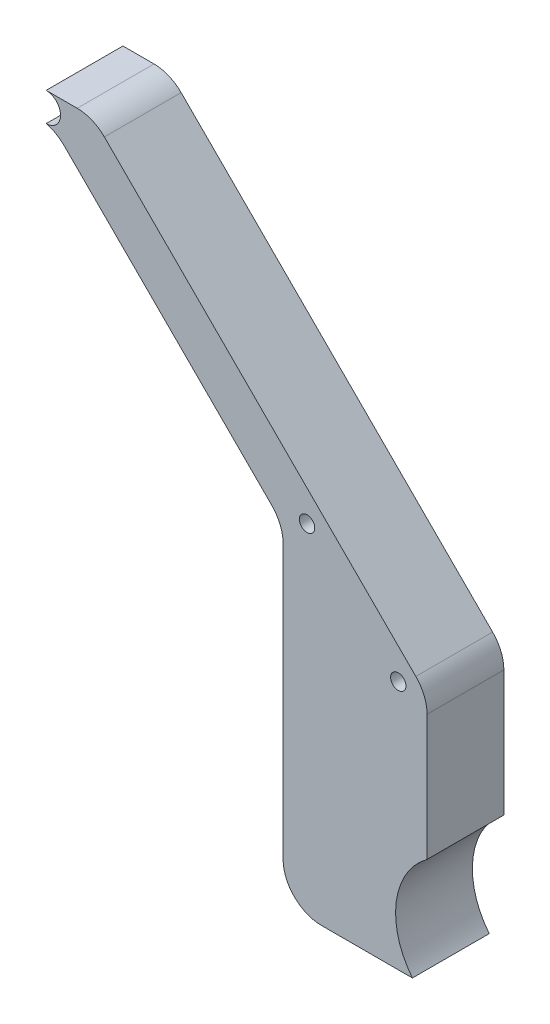
ISO-10303-21;
HEADER;
FILE_DESCRIPTION(('STEP AP214'),'2;1');
FILE_NAME('part.step','',(''),(''),'','','');
FILE_SCHEMA(('AUTOMOTIVE_DESIGN { 1 0 10303 214 1 1 1 1 }'));
ENDSEC;
DATA;
#1=APPLICATION_CONTEXT('core data for automotive mechanical design processes');
#2=APPLICATION_PROTOCOL_DEFINITION('international standard','automotive_design',2000,#1);
#3=PRODUCT_CONTEXT('',#1,'mechanical');
#4=PRODUCT('Part','Part','',(#3));
#5=PRODUCT_RELATED_PRODUCT_CATEGORY('part','',(#4));
#6=PRODUCT_DEFINITION_FORMATION('','',#4);
#7=PRODUCT_DEFINITION_CONTEXT('part definition',#1,'design');
#8=PRODUCT_DEFINITION('design','',#6,#7);
#9=PRODUCT_DEFINITION_SHAPE('','',#8);
#10=(LENGTH_UNIT() NAMED_UNIT(*) SI_UNIT(.MILLI.,.METRE.));
#11=(NAMED_UNIT(*) PLANE_ANGLE_UNIT() SI_UNIT($,.RADIAN.));
#12=(NAMED_UNIT(*) SI_UNIT($,.STERADIAN.) SOLID_ANGLE_UNIT());
#13=UNCERTAINTY_MEASURE_WITH_UNIT(LENGTH_MEASURE(1.E-05),#10,'distance_accuracy_value','');
#14=(GEOMETRIC_REPRESENTATION_CONTEXT(3) GLOBAL_UNCERTAINTY_ASSIGNED_CONTEXT((#13)) GLOBAL_UNIT_ASSIGNED_CONTEXT((#10,
#11,#12)) REPRESENTATION_CONTEXT('',''));
#15=CARTESIAN_POINT('',(0.,0.,0.));
#16=DIRECTION('',(0.,0.,1.));
#17=DIRECTION('',(1.,0.,0.));
#18=AXIS2_PLACEMENT_3D('',#15,#16,#17);
#19=CARTESIAN_POINT('',(0.0303342495161785,8.21230643760333,-8.));
#20=DIRECTION('',(1.,0.,0.));
#21=DIRECTION('',(0.,0.,-1.));
#22=AXIS2_PLACEMENT_3D('',#19,#20,#21);
#23=PLANE('',#22);
#24=DIRECTION('',(0.,0.,1.));
#25=VECTOR('',#24,1.);
#26=CARTESIAN_POINT('',(0.0303342495161819,-6.54052980472011,-8.));
#27=LINE('',#26,#25);
#28=CARTESIAN_POINT('',(0.0303342495161819,-6.54052980472011,-8.));
#29=VERTEX_POINT('',#28);
#30=CARTESIAN_POINT('',(0.0303342495161819,-6.54052980472011,0.));
#31=VERTEX_POINT('',#30);
#32=EDGE_CURVE('E139',#29,#31,#27,.T.);
#33=ORIENTED_EDGE('',*,*,#32,.F.);
#34=DIRECTION('',(0.,1.,0.));
#35=VECTOR('',#34,1.);
#36=CARTESIAN_POINT('',(0.0303342495161785,8.21230643760333,-8.));
#37=LINE('',#36,#35);
#38=CARTESIAN_POINT('',(0.0303342495161785,6.55545218811096,-8.));
#39=VERTEX_POINT('',#38);
#40=EDGE_CURVE('E148',#29,#39,#37,.T.);
#41=ORIENTED_EDGE('',*,*,#40,.T.);
#42=DIRECTION('',(0.,0.,1.));
#43=VECTOR('',#42,1.);
#44=CARTESIAN_POINT('',(0.0303342495161785,6.55545218811096,-8.));
#45=LINE('',#44,#43);
#46=CARTESIAN_POINT('',(0.0303342495161785,6.55545218811096,0.));
#47=VERTEX_POINT('',#46);
#48=EDGE_CURVE('E238',#39,#47,#45,.T.);
#49=ORIENTED_EDGE('',*,*,#48,.T.);
#50=DIRECTION('',(0.,1.,0.));
#51=VECTOR('',#50,1.);
#52=CARTESIAN_POINT('',(0.0303342495161785,8.21230643760333,0.));
#53=LINE('',#52,#51);
#54=EDGE_CURVE('E150',#31,#47,#53,.T.);
#55=ORIENTED_EDGE('',*,*,#54,.F.);
#56=EDGE_LOOP('',(#33,#41,#49,#55));
#57=FACE_BOUND('',#56,.T.);
#58=ADVANCED_FACE('F41',(#57),#23,.T.);
#59=CARTESIAN_POINT('',(-14.9696657504838,4.99999999999992,-8.));
#60=DIRECTION('',(-1.,0.,0.));
#61=DIRECTION('',(0.,-1.,0.));
#62=AXIS2_PLACEMENT_3D('',#59,#60,#61);
#63=PLANE('',#62);
#64=DIRECTION('',(0.,-1.,0.));
#65=VECTOR('',#64,1.);
#66=CARTESIAN_POINT('',(-14.9696657504838,4.99999999999992,-8.));
#67=LINE('',#66,#65);
#68=CARTESIAN_POINT('',(-14.9696657504838,14.4843843762454,-8.));
#69=VERTEX_POINT('',#68);
#70=CARTESIAN_POINT('',(-14.9696657504838,-14.0000000000001,-8.));
#71=VERTEX_POINT('',#70);
#72=EDGE_CURVE('E184',#69,#71,#67,.T.);
#73=ORIENTED_EDGE('',*,*,#72,.T.);
#74=DIRECTION('',(0.,0.,1.));
#75=VECTOR('',#74,1.);
#76=CARTESIAN_POINT('',(-14.9696657504838,-14.0000000000001,-8.));
#77=LINE('',#76,#75);
#78=CARTESIAN_POINT('',(-14.9696657504838,-14.0000000000001,0.));
#79=VERTEX_POINT('',#78);
#80=EDGE_CURVE('E215',#71,#79,#77,.T.);
#81=ORIENTED_EDGE('',*,*,#80,.T.);
#82=DIRECTION('',(0.,-1.,0.));
#83=VECTOR('',#82,1.);
#84=CARTESIAN_POINT('',(-14.9696657504838,4.99999999999992,0.));
#85=LINE('',#84,#83);
#86=CARTESIAN_POINT('',(-14.9696657504838,14.4843843762454,0.));
#87=VERTEX_POINT('',#86);
#88=EDGE_CURVE('E161',#87,#79,#85,.T.);
#89=ORIENTED_EDGE('',*,*,#88,.F.);
#90=DIRECTION('',(0.,0.,1.));
#91=VECTOR('',#90,1.);
#92=CARTESIAN_POINT('',(-14.9696657504838,14.4843843762454,-8.));
#93=LINE('',#92,#91);
#94=EDGE_CURVE('E209',#87,#69,#93,.F.);
#95=ORIENTED_EDGE('',*,*,#94,.T.);
#96=EDGE_LOOP('',(#73,#81,#89,#95));
#97=FACE_BOUND('',#96,.T.);
#98=ADVANCED_FACE('F284',(#97),#63,.T.);
#99=CARTESIAN_POINT('',(-14.9696657504838,16.1412386257378,-8.));
#100=DIRECTION('',(-0.707106781186546,-0.707106781186549,0.));
#101=DIRECTION('',(0.707106781186549,-0.707106781186546,0.));
#102=AXIS2_PLACEMENT_3D('',#99,#100,#101);
#103=PLANE('',#102);
#104=DIRECTION('',(0.707106781186549,-0.707106781186546,0.));
#105=VECTOR('',#104,1.);
#106=CARTESIAN_POINT('',(-14.9696657504838,16.1412386257378,0.));
#107=LINE('',#106,#105);
#108=CARTESIAN_POINT('',(-37.7713252839808,38.9428981592346,0.));
#109=VERTEX_POINT('',#108);
#110=CARTESIAN_POINT('',(-16.1412386257376,17.3128115009916,0.));
#111=VERTEX_POINT('',#110);
#112=EDGE_CURVE('E168',#109,#111,#107,.T.);
#113=ORIENTED_EDGE('',*,*,#112,.F.);
#114=DIRECTION('',(0.,0.,-1.));
#115=VECTOR('',#114,1.);
#116=CARTESIAN_POINT('',(-37.7713252839808,38.9428981592346,-8.));
#117=LINE('',#116,#115);
#118=CARTESIAN_POINT('',(-37.7713252839808,38.9428981592346,-8.));
#119=VERTEX_POINT('',#118);
#120=EDGE_CURVE('E252',#109,#119,#117,.T.);
#121=ORIENTED_EDGE('',*,*,#120,.T.);
#122=DIRECTION('',(0.707106781186549,-0.707106781186546,0.));
#123=VECTOR('',#122,1.);
#124=CARTESIAN_POINT('',(-14.9696657504838,16.1412386257378,-8.));
#125=LINE('',#124,#123);
#126=CARTESIAN_POINT('',(-16.1412386257376,17.3128115009916,-8.));
#127=VERTEX_POINT('',#126);
#128=EDGE_CURVE('E180',#119,#127,#125,.T.);
#129=ORIENTED_EDGE('',*,*,#128,.T.);
#130=DIRECTION('',(0.,0.,1.));
#131=VECTOR('',#130,1.);
#132=CARTESIAN_POINT('',(-16.1412386257376,17.3128115009916,0.));
#133=LINE('',#132,#131);
#134=EDGE_CURVE('E248',#127,#111,#133,.T.);
#135=ORIENTED_EDGE('',*,*,#134,.T.);
#136=EDGE_LOOP('',(#113,#121,#129,#135));
#137=FACE_BOUND('',#136,.T.);
#138=ADVANCED_FACE('F276',(#137),#103,.T.);
#139=CARTESIAN_POINT('',(-39.649665750484,41.5,-8.));
#140=DIRECTION('',(0.,0.,1.));
#141=DIRECTION('',(1.,0.,0.));
#142=AXIS2_PLACEMENT_3D('',#139,#140,#141);
#143=CYLINDRICAL_SURFACE('',#142,1.50000000000007);
#144=CARTESIAN_POINT('',(-39.649665750484,41.5,0.));
#145=DIRECTION('',(0.,0.,-1.));
#146=DIRECTION('',(-1.,0.,0.));
#147=AXIS2_PLACEMENT_3D('',#144,#145,#146);
#148=CIRCLE('',#147,1.50000000000007);
#149=CARTESIAN_POINT('',(-39.649665750484,43.0000000000001,0.));
#150=VERTEX_POINT('',#149);
#151=CARTESIAN_POINT('',(-39.649665750484,39.9999999999999,0.));
#152=VERTEX_POINT('',#151);
#153=EDGE_CURVE('E198',#150,#152,#148,.T.);
#154=ORIENTED_EDGE('',*,*,#153,.F.);
#155=DIRECTION('',(0.,0.,1.));
#156=VECTOR('',#155,1.);
#157=CARTESIAN_POINT('',(-39.649665750484,43.0000000000001,-8.));
#158=LINE('',#157,#156);
#159=CARTESIAN_POINT('',(-39.649665750484,43.0000000000001,-8.));
#160=VERTEX_POINT('',#159);
#161=EDGE_CURVE('E188',#160,#150,#158,.T.);
#162=ORIENTED_EDGE('',*,*,#161,.F.);
#163=CARTESIAN_POINT('',(-39.649665750484,41.5,-8.));
#164=DIRECTION('',(0.,0.,-1.));
#165=DIRECTION('',(-1.,0.,0.));
#166=AXIS2_PLACEMENT_3D('',#163,#164,#165);
#167=CIRCLE('',#166,1.50000000000007);
#168=CARTESIAN_POINT('',(-39.649665750484,39.9999999999999,-8.));
#169=VERTEX_POINT('',#168);
#170=EDGE_CURVE('E176',#160,#169,#167,.T.);
#171=ORIENTED_EDGE('',*,*,#170,.T.);
#172=DIRECTION('',(0.,0.,1.));
#173=VECTOR('',#172,1.);
#174=CARTESIAN_POINT('',(-39.649665750484,39.9999999999999,-8.));
#175=LINE('',#174,#173);
#176=EDGE_CURVE('E205',#169,#152,#175,.T.);
#177=ORIENTED_EDGE('',*,*,#176,.T.);
#178=EDGE_LOOP('',(#154,#162,#171,#177));
#179=FACE_BOUND('',#178,.T.);
#180=ADVANCED_FACE('F372',(#179),#143,.F.);
#181=CARTESIAN_POINT('',(-34.7573593128807,43.0000000000001,-8.));
#182=DIRECTION('',(0.,1.,0.));
#183=DIRECTION('',(0.,0.,1.));
#184=AXIS2_PLACEMENT_3D('',#181,#182,#183);
#185=PLANE('',#184);
#186=DIRECTION('',(-1.,0.,0.));
#187=VECTOR('',#186,1.);
#188=CARTESIAN_POINT('',(-34.7573593128807,43.0000000000001,0.));
#189=LINE('',#188,#187);
#190=CARTESIAN_POINT('',(-36.4142135623731,43.0000000000001,0.));
#191=VERTEX_POINT('',#190);
#192=EDGE_CURVE('E195',#191,#150,#189,.T.);
#193=ORIENTED_EDGE('',*,*,#192,.F.);
#194=DIRECTION('',(0.,0.,1.));
#195=VECTOR('',#194,1.);
#196=CARTESIAN_POINT('',(-36.4142135623731,43.0000000000001,-8.));
#197=LINE('',#196,#195);
#198=CARTESIAN_POINT('',(-36.4142135623731,43.0000000000001,-8.));
#199=VERTEX_POINT('',#198);
#200=EDGE_CURVE('E255',#191,#199,#197,.F.);
#201=ORIENTED_EDGE('',*,*,#200,.T.);
#202=DIRECTION('',(-1.,0.,0.));
#203=VECTOR('',#202,1.);
#204=CARTESIAN_POINT('',(-34.7573593128807,43.0000000000001,-8.));
#205=LINE('',#204,#203);
#206=EDGE_CURVE('E165',#199,#160,#205,.T.);
#207=ORIENTED_EDGE('',*,*,#206,.T.);
#208=ORIENTED_EDGE('',*,*,#161,.T.);
#209=EDGE_LOOP('',(#193,#201,#207,#208));
#210=FACE_BOUND('',#209,.T.);
#211=ADVANCED_FACE('F367',(#210),#185,.T.);
#212=CARTESIAN_POINT('',(-34.7573593128807,43.0000000000001,-8.));
#213=DIRECTION('',(0.707106781186546,0.707106781186549,0.));
#214=DIRECTION('',(-0.707106781186549,0.707106781186546,0.));
#215=AXIS2_PLACEMENT_3D('',#212,#213,#214);
#216=PLANE('',#215);
#217=DIRECTION('',(-0.707106781186549,0.707106781186546,0.));
#218=VECTOR('',#217,1.);
#219=CARTESIAN_POINT('',(-34.7573593128807,43.0000000000001,0.));
#220=LINE('',#219,#218);
#221=CARTESIAN_POINT('',(-1.14123862573765,9.38387931285715,0.));
#222=VERTEX_POINT('',#221);
#223=CARTESIAN_POINT('',(-33.5857864376269,41.8284271247463,0.));
#224=VERTEX_POINT('',#223);
#225=EDGE_CURVE('E191',#222,#224,#220,.T.);
#226=ORIENTED_EDGE('',*,*,#225,.F.);
#227=DIRECTION('',(0.,0.,1.));
#228=VECTOR('',#227,1.);
#229=CARTESIAN_POINT('',(-1.14123862573765,9.38387931285715,-8.));
#230=LINE('',#229,#228);
#231=CARTESIAN_POINT('',(-1.14123862573765,9.38387931285715,-8.));
#232=VERTEX_POINT('',#231);
#233=EDGE_CURVE('E245',#222,#232,#230,.F.);
#234=ORIENTED_EDGE('',*,*,#233,.T.);
#235=DIRECTION('',(-0.707106781186549,0.707106781186546,0.));
#236=VECTOR('',#235,1.);
#237=CARTESIAN_POINT('',(-34.7573593128807,43.0000000000001,-8.));
#238=LINE('',#237,#236);
#239=CARTESIAN_POINT('',(-33.5857864376269,41.8284271247463,-8.));
#240=VERTEX_POINT('',#239);
#241=EDGE_CURVE('E160',#232,#240,#238,.T.);
#242=ORIENTED_EDGE('',*,*,#241,.T.);
#243=DIRECTION('',(0.,0.,1.));
#244=VECTOR('',#243,1.);
#245=CARTESIAN_POINT('',(-33.5857864376269,41.8284271247463,-8.));
#246=LINE('',#245,#244);
#247=EDGE_CURVE('E241',#240,#224,#246,.T.);
#248=ORIENTED_EDGE('',*,*,#247,.T.);
#249=EDGE_LOOP('',(#226,#234,#242,#248));
#250=FACE_BOUND('',#249,.T.);
#251=ADVANCED_FACE('F338',(#250),#216,.T.);
#252=CARTESIAN_POINT('',(-39.649665750484,41.5,-8.));
#253=DIRECTION('',(0.,0.,-1.));
#254=DIRECTION('',(-1.,0.,0.));
#255=AXIS2_PLACEMENT_3D('',#252,#253,#254);
#256=PLANE('',#255);
#257=CARTESIAN_POINT('',(4.75,-13.0000000000001,-8.));
#258=DIRECTION('',(0.,0.,1.));
#259=DIRECTION('',(1.,0.,0.));
#260=AXIS2_PLACEMENT_3D('',#257,#258,#259);
#261=CIRCLE('',#260,8.);
#262=CARTESIAN_POINT('',(-1.49499799839838,-18.0000000000001,-8.));
#263=VERTEX_POINT('',#262);
#264=EDGE_CURVE('E136',#29,#263,#261,.T.);
#265=ORIENTED_EDGE('',*,*,#264,.T.);
#266=DIRECTION('',(1.,0.,0.));
#267=VECTOR('',#266,1.);
#268=CARTESIAN_POINT('',(-14.9696657504838,-18.0000000000001,-8.));
#269=LINE('',#268,#267);
#270=CARTESIAN_POINT('',(-10.9696657504838,-18.0000000000001,-8.));
#271=VERTEX_POINT('',#270);
#272=EDGE_CURVE('E294',#271,#263,#269,.T.);
#273=ORIENTED_EDGE('',*,*,#272,.F.);
#274=CARTESIAN_POINT('',(-10.9696657504838,-14.0000000000001,-8.));
#275=DIRECTION('',(0.,0.,-1.));
#276=DIRECTION('',(-1.,0.,0.));
#277=AXIS2_PLACEMENT_3D('',#274,#275,#276);
#278=CIRCLE('',#277,4.);
#279=EDGE_CURVE('E235',#271,#71,#278,.T.);
#280=ORIENTED_EDGE('',*,*,#279,.T.);
#281=ORIENTED_EDGE('',*,*,#72,.F.);
#282=CARTESIAN_POINT('',(-18.9696657504838,14.4843843762454,-8.));
#283=DIRECTION('',(0.,0.,-1.));
#284=DIRECTION('',(-1.,0.,0.));
#285=AXIS2_PLACEMENT_3D('',#282,#283,#284);
#286=CIRCLE('',#285,4.);
#287=EDGE_CURVE('E50',#69,#127,#286,.F.);
#288=ORIENTED_EDGE('',*,*,#287,.T.);
#289=ORIENTED_EDGE('',*,*,#128,.F.);
#290=CARTESIAN_POINT('',(-40.599752408727,36.1144710344884,-8.));
#291=DIRECTION('',(0.,0.,-1.));
#292=DIRECTION('',(-1.,0.,0.));
#293=AXIS2_PLACEMENT_3D('',#290,#291,#292);
#294=CIRCLE('',#293,4.);
#295=EDGE_CURVE('E261',#119,#169,#294,.F.);
#296=ORIENTED_EDGE('',*,*,#295,.T.);
#297=ORIENTED_EDGE('',*,*,#170,.F.);
#298=ORIENTED_EDGE('',*,*,#206,.F.);
#299=CARTESIAN_POINT('',(-36.4142135623731,39.0000000000001,-8.));
#300=DIRECTION('',(0.,0.,-1.));
#301=DIRECTION('',(-1.,0.,0.));
#302=AXIS2_PLACEMENT_3D('',#299,#300,#301);
#303=CIRCLE('',#302,4.);
#304=EDGE_CURVE('E64',#199,#240,#303,.T.);
#305=ORIENTED_EDGE('',*,*,#304,.T.);
#306=ORIENTED_EDGE('',*,*,#241,.F.);
#307=CARTESIAN_POINT('',(-3.96966575048382,6.55545218811096,-8.));
#308=DIRECTION('',(0.,0.,-1.));
#309=DIRECTION('',(-1.,0.,0.));
#310=AXIS2_PLACEMENT_3D('',#307,#308,#309);
#311=CIRCLE('',#310,4.);
#312=EDGE_CURVE('E157',#232,#39,#311,.T.);
#313=ORIENTED_EDGE('',*,*,#312,.T.);
#314=ORIENTED_EDGE('',*,*,#40,.F.);
#315=EDGE_LOOP('',(#265,#273,#280,#281,#288,#289,#296,#297,#298,#305,#306,#313,#314));
#316=FACE_BOUND('',#315,.T.);
#317=CARTESIAN_POINT('',(-2.96966575048382,7.99999999999992,-8.));
#318=DIRECTION('',(0.,0.,1.));
#319=DIRECTION('',(1.,0.,0.));
#320=AXIS2_PLACEMENT_3D('',#317,#318,#319);
#321=CIRCLE('',#320,0.799999999999998);
#322=CARTESIAN_POINT('',(-2.16966575048382,7.99999999999992,-8.));
#323=VERTEX_POINT('',#322);
#324=EDGE_CURVE('E304',#323,#323,#321,.T.);
#325=ORIENTED_EDGE('',*,*,#324,.T.);
#326=EDGE_LOOP('',(#325));
#327=FACE_BOUND('',#326,.T.);
#328=CARTESIAN_POINT('',(-12.4696657504838,17.4999999999999,-8.));
#329=DIRECTION('',(0.,0.,1.));
#330=DIRECTION('',(1.,0.,0.));
#331=AXIS2_PLACEMENT_3D('',#328,#329,#330);
#332=CIRCLE('',#331,0.799999999999999);
#333=CARTESIAN_POINT('',(-11.6696657504838,17.4999999999999,-8.));
#334=VERTEX_POINT('',#333);
#335=EDGE_CURVE('E171',#334,#334,#332,.T.);
#336=ORIENTED_EDGE('',*,*,#335,.T.);
#337=EDGE_LOOP('',(#336));
#338=FACE_BOUND('',#337,.T.);
#339=ADVANCED_FACE('F154',(#316,#327,#338),#256,.T.);
#340=CARTESIAN_POINT('',(-39.649665750484,41.5,0.));
#341=DIRECTION('',(0.,0.,-1.));
#342=DIRECTION('',(-1.,0.,0.));
#343=AXIS2_PLACEMENT_3D('',#340,#341,#342);
#344=PLANE('',#343);
#345=CARTESIAN_POINT('',(-2.96966575048382,7.99999999999992,0.));
#346=DIRECTION('',(0.,0.,1.));
#347=DIRECTION('',(1.,0.,0.));
#348=AXIS2_PLACEMENT_3D('',#345,#346,#347);
#349=CIRCLE('',#348,0.799999999999999);
#350=CARTESIAN_POINT('',(-2.16966575048382,7.99999999999992,0.));
#351=VERTEX_POINT('',#350);
#352=EDGE_CURVE('E297',#351,#351,#349,.T.);
#353=ORIENTED_EDGE('',*,*,#352,.F.);
#354=EDGE_LOOP('',(#353));
#355=FACE_BOUND('',#354,.T.);
#356=CARTESIAN_POINT('',(-12.4696657504838,17.4999999999999,0.));
#357=DIRECTION('',(0.,0.,1.));
#358=DIRECTION('',(1.,0.,0.));
#359=AXIS2_PLACEMENT_3D('',#356,#357,#358);
#360=CIRCLE('',#359,0.799999999999999);
#361=CARTESIAN_POINT('',(-11.6696657504838,17.4999999999999,0.));
#362=VERTEX_POINT('',#361);
#363=EDGE_CURVE('E307',#362,#362,#360,.T.);
#364=ORIENTED_EDGE('',*,*,#363,.F.);
#365=EDGE_LOOP('',(#364));
#366=FACE_BOUND('',#365,.T.);
#367=DIRECTION('',(1.,0.,0.));
#368=VECTOR('',#367,1.);
#369=CARTESIAN_POINT('',(-14.9696657504838,-18.0000000000001,0.));
#370=LINE('',#369,#368);
#371=CARTESIAN_POINT('',(-10.9696657504838,-18.0000000000001,0.));
#372=VERTEX_POINT('',#371);
#373=CARTESIAN_POINT('',(-1.49499799839838,-18.0000000000001,0.));
#374=VERTEX_POINT('',#373);
#375=EDGE_CURVE('E152',#372,#374,#370,.T.);
#376=ORIENTED_EDGE('',*,*,#375,.T.);
#377=CARTESIAN_POINT('',(4.75,-13.0000000000001,0.));
#378=DIRECTION('',(0.,0.,1.));
#379=DIRECTION('',(1.,0.,0.));
#380=AXIS2_PLACEMENT_3D('',#377,#378,#379);
#381=CIRCLE('',#380,8.);
#382=EDGE_CURVE('E56',#31,#374,#381,.T.);
#383=ORIENTED_EDGE('',*,*,#382,.F.);
#384=ORIENTED_EDGE('',*,*,#54,.T.);
#385=CARTESIAN_POINT('',(-3.96966575048382,6.55545218811096,0.));
#386=DIRECTION('',(0.,0.,-1.));
#387=DIRECTION('',(-1.,0.,0.));
#388=AXIS2_PLACEMENT_3D('',#385,#386,#387);
#389=CIRCLE('',#388,4.);
#390=EDGE_CURVE('E222',#47,#222,#389,.F.);
#391=ORIENTED_EDGE('',*,*,#390,.T.);
#392=ORIENTED_EDGE('',*,*,#225,.T.);
#393=CARTESIAN_POINT('',(-36.4142135623731,39.0000000000001,0.));
#394=DIRECTION('',(0.,0.,-1.));
#395=DIRECTION('',(-1.,0.,0.));
#396=AXIS2_PLACEMENT_3D('',#393,#394,#395);
#397=CIRCLE('',#396,4.);
#398=EDGE_CURVE('E219',#224,#191,#397,.F.);
#399=ORIENTED_EDGE('',*,*,#398,.T.);
#400=ORIENTED_EDGE('',*,*,#192,.T.);
#401=ORIENTED_EDGE('',*,*,#153,.T.);
#402=CARTESIAN_POINT('',(-40.599752408727,36.1144710344884,0.));
#403=DIRECTION('',(0.,0.,-1.));
#404=DIRECTION('',(-1.,0.,0.));
#405=AXIS2_PLACEMENT_3D('',#402,#403,#404);
#406=CIRCLE('',#405,4.);
#407=EDGE_CURVE('E258',#152,#109,#406,.T.);
#408=ORIENTED_EDGE('',*,*,#407,.T.);
#409=ORIENTED_EDGE('',*,*,#112,.T.);
#410=CARTESIAN_POINT('',(-18.9696657504838,14.4843843762454,0.));
#411=DIRECTION('',(0.,0.,-1.));
#412=DIRECTION('',(-1.,0.,0.));
#413=AXIS2_PLACEMENT_3D('',#410,#411,#412);
#414=CIRCLE('',#413,4.);
#415=EDGE_CURVE('E264',#111,#87,#414,.T.);
#416=ORIENTED_EDGE('',*,*,#415,.T.);
#417=ORIENTED_EDGE('',*,*,#88,.T.);
#418=CARTESIAN_POINT('',(-10.9696657504838,-14.0000000000001,0.));
#419=DIRECTION('',(0.,0.,-1.));
#420=DIRECTION('',(-1.,0.,0.));
#421=AXIS2_PLACEMENT_3D('',#418,#419,#420);
#422=CIRCLE('',#421,4.);
#423=EDGE_CURVE('E225',#79,#372,#422,.F.);
#424=ORIENTED_EDGE('',*,*,#423,.T.);
#425=EDGE_LOOP('',(#376,#383,#384,#391,#392,#399,#400,#401,#408,#409,#416,#417,#424));
#426=FACE_BOUND('',#425,.T.);
#427=ADVANCED_FACE('F282',(#355,#366,#426),#344,.F.);
#428=CARTESIAN_POINT('',(-12.4696657504838,17.4999999999999,0.));
#429=DIRECTION('',(0.,0.,1.));
#430=DIRECTION('',(1.,0.,0.));
#431=AXIS2_PLACEMENT_3D('',#428,#429,#430);
#432=CYLINDRICAL_SURFACE('',#431,0.799999999999999);
#433=ORIENTED_EDGE('',*,*,#335,.F.);
#434=EDGE_LOOP('',(#433));
#435=FACE_BOUND('',#434,.T.);
#436=ORIENTED_EDGE('',*,*,#363,.T.);
#437=EDGE_LOOP('',(#436));
#438=FACE_BOUND('',#437,.T.);
#439=ADVANCED_FACE('F317',(#435,#438),#432,.F.);
#440=CARTESIAN_POINT('',(-2.96966575048382,7.99999999999992,0.));
#441=DIRECTION('',(0.,0.,1.));
#442=DIRECTION('',(1.,0.,0.));
#443=AXIS2_PLACEMENT_3D('',#440,#441,#442);
#444=CYLINDRICAL_SURFACE('',#443,0.799999999999998);
#445=ORIENTED_EDGE('',*,*,#324,.F.);
#446=EDGE_LOOP('',(#445));
#447=FACE_BOUND('',#446,.T.);
#448=ORIENTED_EDGE('',*,*,#352,.T.);
#449=EDGE_LOOP('',(#448));
#450=FACE_BOUND('',#449,.T.);
#451=ADVANCED_FACE('F319',(#447,#450),#444,.F.);
#452=CARTESIAN_POINT('',(-14.9696657504838,-18.0000000000001,-35.459060435492));
#453=DIRECTION('',(0.,-1.,0.));
#454=DIRECTION('',(0.,0.,-1.));
#455=AXIS2_PLACEMENT_3D('',#452,#453,#454);
#456=PLANE('',#455);
#457=DIRECTION('',(0.,0.,1.));
#458=VECTOR('',#457,1.);
#459=CARTESIAN_POINT('',(-1.49499799839838,-18.0000000000001,-8.));
#460=LINE('',#459,#458);
#461=EDGE_CURVE('E11',#374,#263,#460,.F.);
#462=ORIENTED_EDGE('',*,*,#461,.F.);
#463=ORIENTED_EDGE('',*,*,#375,.F.);
#464=DIRECTION('',(0.,0.,1.));
#465=VECTOR('',#464,1.);
#466=CARTESIAN_POINT('',(-10.9696657504838,-18.0000000000001,-35.459060435492));
#467=LINE('',#466,#465);
#468=EDGE_CURVE('E228',#372,#271,#467,.F.);
#469=ORIENTED_EDGE('',*,*,#468,.T.);
#470=ORIENTED_EDGE('',*,*,#272,.T.);
#471=EDGE_LOOP('',(#462,#463,#469,#470));
#472=FACE_BOUND('',#471,.T.);
#473=ADVANCED_FACE('F292',(#472),#456,.T.);
#474=CARTESIAN_POINT('',(-10.9696657504838,-14.0000000000001,-8.));
#475=DIRECTION('',(0.,0.,1.));
#476=DIRECTION('',(1.,0.,0.));
#477=AXIS2_PLACEMENT_3D('',#474,#475,#476);
#478=CYLINDRICAL_SURFACE('',#477,4.);
#479=ORIENTED_EDGE('',*,*,#279,.F.);
#480=ORIENTED_EDGE('',*,*,#468,.F.);
#481=ORIENTED_EDGE('',*,*,#423,.F.);
#482=ORIENTED_EDGE('',*,*,#80,.F.);
#483=EDGE_LOOP('',(#479,#480,#481,#482));
#484=FACE_BOUND('',#483,.T.);
#485=ADVANCED_FACE('F288',(#484),#478,.T.);
#486=CARTESIAN_POINT('',(-3.96966575048382,6.55545218811096,-8.));
#487=DIRECTION('',(0.,0.,1.));
#488=DIRECTION('',(1.,0.,0.));
#489=AXIS2_PLACEMENT_3D('',#486,#487,#488);
#490=CYLINDRICAL_SURFACE('',#489,4.);
#491=ORIENTED_EDGE('',*,*,#312,.F.);
#492=ORIENTED_EDGE('',*,*,#233,.F.);
#493=ORIENTED_EDGE('',*,*,#390,.F.);
#494=ORIENTED_EDGE('',*,*,#48,.F.);
#495=EDGE_LOOP('',(#491,#492,#493,#494));
#496=FACE_BOUND('',#495,.T.);
#497=ADVANCED_FACE('F342',(#496),#490,.T.);
#498=CARTESIAN_POINT('',(-40.599752408727,36.1144710344884,-8.));
#499=DIRECTION('',(0.,0.,1.));
#500=DIRECTION('',(1.,0.,0.));
#501=AXIS2_PLACEMENT_3D('',#498,#499,#500);
#502=CYLINDRICAL_SURFACE('',#501,4.);
#503=ORIENTED_EDGE('',*,*,#295,.F.);
#504=ORIENTED_EDGE('',*,*,#120,.F.);
#505=ORIENTED_EDGE('',*,*,#407,.F.);
#506=ORIENTED_EDGE('',*,*,#176,.F.);
#507=EDGE_LOOP('',(#503,#504,#505,#506));
#508=FACE_BOUND('',#507,.T.);
#509=ADVANCED_FACE('F345',(#508),#502,.F.);
#510=CARTESIAN_POINT('',(-18.9696657504838,14.4843843762454,-8.));
#511=DIRECTION('',(0.,0.,-1.));
#512=DIRECTION('',(-1.,0.,0.));
#513=AXIS2_PLACEMENT_3D('',#510,#511,#512);
#514=CYLINDRICAL_SURFACE('',#513,4.);
#515=ORIENTED_EDGE('',*,*,#287,.F.);
#516=ORIENTED_EDGE('',*,*,#94,.F.);
#517=ORIENTED_EDGE('',*,*,#415,.F.);
#518=ORIENTED_EDGE('',*,*,#134,.F.);
#519=EDGE_LOOP('',(#515,#516,#517,#518));
#520=FACE_BOUND('',#519,.T.);
#521=ADVANCED_FACE('F278',(#520),#514,.F.);
#522=CARTESIAN_POINT('',(-36.4142135623731,39.0000000000001,-8.));
#523=DIRECTION('',(0.,0.,1.));
#524=DIRECTION('',(1.,0.,0.));
#525=AXIS2_PLACEMENT_3D('',#522,#523,#524);
#526=CYLINDRICAL_SURFACE('',#525,4.);
#527=ORIENTED_EDGE('',*,*,#304,.F.);
#528=ORIENTED_EDGE('',*,*,#200,.F.);
#529=ORIENTED_EDGE('',*,*,#398,.F.);
#530=ORIENTED_EDGE('',*,*,#247,.F.);
#531=EDGE_LOOP('',(#527,#528,#529,#530));
#532=FACE_BOUND('',#531,.T.);
#533=ADVANCED_FACE('F43',(#532),#526,.T.);
#534=CARTESIAN_POINT('',(4.75,-13.0000000000001,-8.));
#535=DIRECTION('',(0.,0.,1.));
#536=DIRECTION('',(1.,0.,0.));
#537=AXIS2_PLACEMENT_3D('',#534,#535,#536);
#538=CYLINDRICAL_SURFACE('',#537,8.);
#539=ORIENTED_EDGE('',*,*,#461,.T.);
#540=ORIENTED_EDGE('',*,*,#264,.F.);
#541=ORIENTED_EDGE('',*,*,#32,.T.);
#542=ORIENTED_EDGE('',*,*,#382,.T.);
#543=EDGE_LOOP('',(#539,#540,#541,#542));
#544=FACE_BOUND('',#543,.T.);
#545=ADVANCED_FACE('F138',(#544),#538,.F.);
#546=CLOSED_SHELL('',(#58,#98,#138,#180,#211,#251,#339,#427,#439,#451,#473,#485,#497,#509,#521,
#533,#545));
#547=MANIFOLD_SOLID_BREP('B2',#546);
#548=ADVANCED_BREP_SHAPE_REPRESENTATION('',(#18,#547),#14);
#549=SHAPE_DEFINITION_REPRESENTATION(#9,#548);
ENDSEC;
END-ISO-10303-21;
